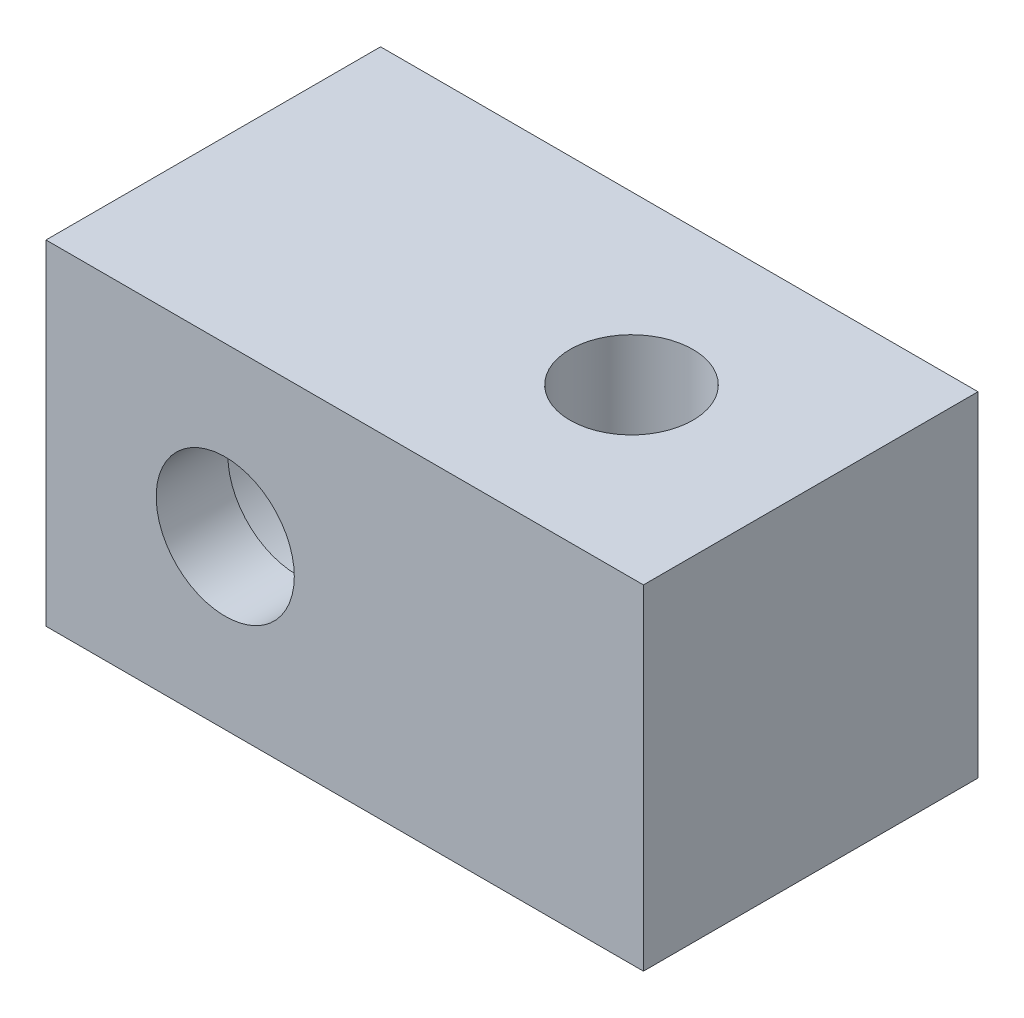
ISO-10303-21;
HEADER;
FILE_DESCRIPTION(('STEP AP214'),'2;1');
FILE_NAME('part.step','',(''),(''),'','','');
FILE_SCHEMA(('AUTOMOTIVE_DESIGN { 1 0 10303 214 1 1 1 1 }'));
ENDSEC;
DATA;
#1=APPLICATION_CONTEXT('core data for automotive mechanical design processes');
#2=APPLICATION_PROTOCOL_DEFINITION('international standard','automotive_design',2000,#1);
#3=PRODUCT_CONTEXT('',#1,'mechanical');
#4=PRODUCT('Part','Part','',(#3));
#5=PRODUCT_RELATED_PRODUCT_CATEGORY('part','',(#4));
#6=PRODUCT_DEFINITION_FORMATION('','',#4);
#7=PRODUCT_DEFINITION_CONTEXT('part definition',#1,'design');
#8=PRODUCT_DEFINITION('design','',#6,#7);
#9=PRODUCT_DEFINITION_SHAPE('','',#8);
#10=(LENGTH_UNIT() NAMED_UNIT(*) SI_UNIT(.MILLI.,.METRE.));
#11=(NAMED_UNIT(*) PLANE_ANGLE_UNIT() SI_UNIT($,.RADIAN.));
#12=(NAMED_UNIT(*) SI_UNIT($,.STERADIAN.) SOLID_ANGLE_UNIT());
#13=UNCERTAINTY_MEASURE_WITH_UNIT(LENGTH_MEASURE(1.E-05),#10,'distance_accuracy_value','');
#14=(GEOMETRIC_REPRESENTATION_CONTEXT(3) GLOBAL_UNCERTAINTY_ASSIGNED_CONTEXT((#13)) GLOBAL_UNIT_ASSIGNED_CONTEXT((#10,
#11,#12)) REPRESENTATION_CONTEXT('',''));
#15=CARTESIAN_POINT('',(0.,0.,0.));
#16=DIRECTION('',(0.,0.,1.));
#17=DIRECTION('',(1.,0.,0.));
#18=AXIS2_PLACEMENT_3D('',#15,#16,#17);
#19=CARTESIAN_POINT('',(15.875,17.78,-8.89));
#20=DIRECTION('',(-1.,0.,0.));
#21=DIRECTION('',(0.,0.,1.));
#22=AXIS2_PLACEMENT_3D('',#19,#20,#21);
#23=PLANE('',#22);
#24=DIRECTION('',(0.,0.,-1.));
#25=VECTOR('',#24,1.);
#26=CARTESIAN_POINT('',(15.875,0.,-8.89));
#27=LINE('',#26,#25);
#28=CARTESIAN_POINT('',(15.875,0.,8.89));
#29=VERTEX_POINT('',#28);
#30=CARTESIAN_POINT('',(15.875,0.,-8.89));
#31=VERTEX_POINT('',#30);
#32=EDGE_CURVE('E100',#29,#31,#27,.T.);
#33=ORIENTED_EDGE('',*,*,#32,.T.);
#34=DIRECTION('',(0.,-1.,0.));
#35=VECTOR('',#34,1.);
#36=CARTESIAN_POINT('',(15.875,17.78,-8.89));
#37=LINE('',#36,#35);
#38=CARTESIAN_POINT('',(15.875,17.78,-8.89));
#39=VERTEX_POINT('',#38);
#40=EDGE_CURVE('E11',#39,#31,#37,.T.);
#41=ORIENTED_EDGE('',*,*,#40,.F.);
#42=DIRECTION('',(0.,0.,-1.));
#43=VECTOR('',#42,1.);
#44=CARTESIAN_POINT('',(15.875,17.78,-8.89));
#45=LINE('',#44,#43);
#46=CARTESIAN_POINT('',(15.875,17.78,8.89));
#47=VERTEX_POINT('',#46);
#48=EDGE_CURVE('E88',#47,#39,#45,.T.);
#49=ORIENTED_EDGE('',*,*,#48,.F.);
#50=DIRECTION('',(0.,-1.,0.));
#51=VECTOR('',#50,1.);
#52=CARTESIAN_POINT('',(15.875,17.78,8.89));
#53=LINE('',#52,#51);
#54=EDGE_CURVE('E96',#47,#29,#53,.T.);
#55=ORIENTED_EDGE('',*,*,#54,.T.);
#56=EDGE_LOOP('',(#33,#41,#49,#55));
#57=FACE_BOUND('',#56,.T.);
#58=ADVANCED_FACE('F37',(#57),#23,.F.);
#59=CARTESIAN_POINT('',(-15.875,17.78,-8.89));
#60=DIRECTION('',(0.,0.,1.));
#61=DIRECTION('',(1.,0.,0.));
#62=AXIS2_PLACEMENT_3D('',#59,#60,#61);
#63=PLANE('',#62);
#64=CARTESIAN_POINT('',(-6.35,8.89,-8.89));
#65=DIRECTION('',(0.,0.,-1.));
#66=DIRECTION('',(-1.,0.,0.));
#67=AXIS2_PLACEMENT_3D('',#64,#65,#66);
#68=CIRCLE('',#67,6.4389);
#69=CARTESIAN_POINT('',(-12.7889,8.89,-8.89));
#70=VERTEX_POINT('',#69);
#71=EDGE_CURVE('E114',#70,#70,#68,.T.);
#72=ORIENTED_EDGE('',*,*,#71,.F.);
#73=EDGE_LOOP('',(#72));
#74=FACE_BOUND('',#73,.T.);
#75=DIRECTION('',(-1.,0.,0.));
#76=VECTOR('',#75,1.);
#77=CARTESIAN_POINT('',(-15.875,0.,-8.89));
#78=LINE('',#77,#76);
#79=CARTESIAN_POINT('',(-15.875,0.,-8.89));
#80=VERTEX_POINT('',#79);
#81=EDGE_CURVE('E92',#31,#80,#78,.T.);
#82=ORIENTED_EDGE('',*,*,#81,.T.);
#83=DIRECTION('',(0.,-1.,0.));
#84=VECTOR('',#83,1.);
#85=CARTESIAN_POINT('',(-15.875,17.78,-8.89));
#86=LINE('',#85,#84);
#87=CARTESIAN_POINT('',(-15.875,17.78,-8.89));
#88=VERTEX_POINT('',#87);
#89=EDGE_CURVE('E45',#88,#80,#86,.T.);
#90=ORIENTED_EDGE('',*,*,#89,.F.);
#91=DIRECTION('',(-1.,0.,0.));
#92=VECTOR('',#91,1.);
#93=CARTESIAN_POINT('',(-15.875,17.78,-8.89));
#94=LINE('',#93,#92);
#95=EDGE_CURVE('E83',#39,#88,#94,.T.);
#96=ORIENTED_EDGE('',*,*,#95,.F.);
#97=ORIENTED_EDGE('',*,*,#40,.T.);
#98=EDGE_LOOP('',(#82,#90,#96,#97));
#99=FACE_BOUND('',#98,.T.);
#100=ADVANCED_FACE('F91',(#74,#99),#63,.F.);
#101=CARTESIAN_POINT('',(-15.875,17.78,-8.89));
#102=DIRECTION('',(1.,0.,0.));
#103=DIRECTION('',(0.,0.,-1.));
#104=AXIS2_PLACEMENT_3D('',#101,#102,#103);
#105=PLANE('',#104);
#106=DIRECTION('',(0.,0.,1.));
#107=VECTOR('',#106,1.);
#108=CARTESIAN_POINT('',(-15.875,0.,-8.89));
#109=LINE('',#108,#107);
#110=CARTESIAN_POINT('',(-15.875,0.,8.89));
#111=VERTEX_POINT('',#110);
#112=EDGE_CURVE('E70',#80,#111,#109,.T.);
#113=ORIENTED_EDGE('',*,*,#112,.T.);
#114=DIRECTION('',(0.,-1.,0.));
#115=VECTOR('',#114,1.);
#116=CARTESIAN_POINT('',(-15.875,17.78,8.89));
#117=LINE('',#116,#115);
#118=CARTESIAN_POINT('',(-15.875,17.78,8.89));
#119=VERTEX_POINT('',#118);
#120=EDGE_CURVE('E93',#119,#111,#117,.T.);
#121=ORIENTED_EDGE('',*,*,#120,.F.);
#122=DIRECTION('',(0.,0.,1.));
#123=VECTOR('',#122,1.);
#124=CARTESIAN_POINT('',(-15.875,17.78,-8.89));
#125=LINE('',#124,#123);
#126=EDGE_CURVE('E86',#88,#119,#125,.T.);
#127=ORIENTED_EDGE('',*,*,#126,.F.);
#128=ORIENTED_EDGE('',*,*,#89,.T.);
#129=EDGE_LOOP('',(#113,#121,#127,#128));
#130=FACE_BOUND('',#129,.T.);
#131=ADVANCED_FACE('F94',(#130),#105,.F.);
#132=CARTESIAN_POINT('',(-15.875,17.78,8.89));
#133=DIRECTION('',(0.,0.,-1.));
#134=DIRECTION('',(-1.,0.,0.));
#135=AXIS2_PLACEMENT_3D('',#132,#133,#134);
#136=PLANE('',#135);
#137=CARTESIAN_POINT('',(-6.35,8.89,8.89));
#138=DIRECTION('',(0.,0.,1.));
#139=DIRECTION('',(1.,0.,0.));
#140=AXIS2_PLACEMENT_3D('',#137,#138,#139);
#141=CIRCLE('',#140,3.6703);
#142=CARTESIAN_POINT('',(-2.6797,8.89,8.89));
#143=VERTEX_POINT('',#142);
#144=EDGE_CURVE('E117',#143,#143,#141,.T.);
#145=ORIENTED_EDGE('',*,*,#144,.F.);
#146=EDGE_LOOP('',(#145));
#147=FACE_BOUND('',#146,.T.);
#148=DIRECTION('',(1.,0.,0.));
#149=VECTOR('',#148,1.);
#150=CARTESIAN_POINT('',(-15.875,0.,8.89));
#151=LINE('',#150,#149);
#152=EDGE_CURVE('E76',#111,#29,#151,.T.);
#153=ORIENTED_EDGE('',*,*,#152,.T.);
#154=ORIENTED_EDGE('',*,*,#54,.F.);
#155=DIRECTION('',(1.,0.,0.));
#156=VECTOR('',#155,1.);
#157=CARTESIAN_POINT('',(-15.875,17.78,8.89));
#158=LINE('',#157,#156);
#159=EDGE_CURVE('E53',#119,#47,#158,.T.);
#160=ORIENTED_EDGE('',*,*,#159,.F.);
#161=ORIENTED_EDGE('',*,*,#120,.T.);
#162=EDGE_LOOP('',(#153,#154,#160,#161));
#163=FACE_BOUND('',#162,.T.);
#164=ADVANCED_FACE('F108',(#147,#163),#136,.F.);
#165=CARTESIAN_POINT('',(0.,17.78,0.));
#166=DIRECTION('',(0.,1.,0.));
#167=DIRECTION('',(0.,0.,1.));
#168=AXIS2_PLACEMENT_3D('',#165,#166,#167);
#169=PLANE('',#168);
#170=CARTESIAN_POINT('',(6.35,17.78,0.));
#171=DIRECTION('',(0.,1.,0.));
#172=DIRECTION('',(0.,0.,1.));
#173=AXIS2_PLACEMENT_3D('',#170,#171,#172);
#174=CIRCLE('',#173,3.2639);
#175=CARTESIAN_POINT('',(6.35,17.78,3.2639));
#176=VERTEX_POINT('',#175);
#177=EDGE_CURVE('E128',#176,#176,#174,.T.);
#178=ORIENTED_EDGE('',*,*,#177,.F.);
#179=EDGE_LOOP('',(#178));
#180=FACE_BOUND('',#179,.T.);
#181=ORIENTED_EDGE('',*,*,#48,.T.);
#182=ORIENTED_EDGE('',*,*,#95,.T.);
#183=ORIENTED_EDGE('',*,*,#126,.T.);
#184=ORIENTED_EDGE('',*,*,#159,.T.);
#185=EDGE_LOOP('',(#181,#182,#183,#184));
#186=FACE_BOUND('',#185,.T.);
#187=ADVANCED_FACE('F84',(#180,#186),#169,.T.);
#188=CARTESIAN_POINT('',(0.,0.,0.));
#189=DIRECTION('',(0.,1.,0.));
#190=DIRECTION('',(0.,0.,1.));
#191=AXIS2_PLACEMENT_3D('',#188,#189,#190);
#192=PLANE('',#191);
#193=CARTESIAN_POINT('',(6.35,0.,0.));
#194=DIRECTION('',(0.,1.,0.));
#195=DIRECTION('',(0.,0.,1.));
#196=AXIS2_PLACEMENT_3D('',#193,#194,#195);
#197=CIRCLE('',#196,3.2639);
#198=CARTESIAN_POINT('',(6.35,0.,3.2639));
#199=VERTEX_POINT('',#198);
#200=EDGE_CURVE('E123',#199,#199,#197,.T.);
#201=ORIENTED_EDGE('',*,*,#200,.T.);
#202=EDGE_LOOP('',(#201));
#203=FACE_BOUND('',#202,.T.);
#204=ORIENTED_EDGE('',*,*,#32,.F.);
#205=ORIENTED_EDGE('',*,*,#152,.F.);
#206=ORIENTED_EDGE('',*,*,#112,.F.);
#207=ORIENTED_EDGE('',*,*,#81,.F.);
#208=EDGE_LOOP('',(#204,#205,#206,#207));
#209=FACE_BOUND('',#208,.T.);
#210=ADVANCED_FACE('F111',(#203,#209),#192,.F.);
#211=CARTESIAN_POINT('',(-6.35,8.89,5.08));
#212=DIRECTION('',(0.,0.,-1.));
#213=DIRECTION('',(-1.,0.,0.));
#214=AXIS2_PLACEMENT_3D('',#211,#212,#213);
#215=CYLINDRICAL_SURFACE('',#214,6.4389);
#216=CARTESIAN_POINT('',(-6.35,8.89,5.08));
#217=DIRECTION('',(0.,0.,-1.));
#218=DIRECTION('',(-1.,0.,0.));
#219=AXIS2_PLACEMENT_3D('',#216,#217,#218);
#220=CIRCLE('',#219,6.4389);
#221=CARTESIAN_POINT('',(-12.7889,8.89,5.08));
#222=VERTEX_POINT('',#221);
#223=EDGE_CURVE('E103',#222,#222,#220,.T.);
#224=ORIENTED_EDGE('',*,*,#223,.F.);
#225=EDGE_LOOP('',(#224));
#226=FACE_BOUND('',#225,.T.);
#227=ORIENTED_EDGE('',*,*,#71,.T.);
#228=EDGE_LOOP('',(#227));
#229=FACE_BOUND('',#228,.T.);
#230=ADVANCED_FACE('F140',(#226,#229),#215,.F.);
#231=CARTESIAN_POINT('',(-6.35,8.89,5.08));
#232=DIRECTION('',(0.,0.,-1.));
#233=DIRECTION('',(-1.,0.,0.));
#234=AXIS2_PLACEMENT_3D('',#231,#232,#233);
#235=PLANE('',#234);
#236=CARTESIAN_POINT('',(-6.35,8.89,5.08));
#237=DIRECTION('',(0.,0.,-1.));
#238=DIRECTION('',(-1.,0.,0.));
#239=AXIS2_PLACEMENT_3D('',#236,#237,#238);
#240=CIRCLE('',#239,3.6703);
#241=CARTESIAN_POINT('',(-10.0203,8.89,5.08));
#242=VERTEX_POINT('',#241);
#243=EDGE_CURVE('E120',#242,#242,#240,.F.);
#244=ORIENTED_EDGE('',*,*,#243,.T.);
#245=EDGE_LOOP('',(#244));
#246=FACE_BOUND('',#245,.T.);
#247=ORIENTED_EDGE('',*,*,#223,.T.);
#248=EDGE_LOOP('',(#247));
#249=FACE_BOUND('',#248,.T.);
#250=ADVANCED_FACE('F158',(#246,#249),#235,.T.);
#251=CARTESIAN_POINT('',(-6.35,8.89,-8.891));
#252=DIRECTION('',(0.,0.,1.));
#253=DIRECTION('',(1.,0.,0.));
#254=AXIS2_PLACEMENT_3D('',#251,#252,#253);
#255=CYLINDRICAL_SURFACE('',#254,3.6703);
#256=ORIENTED_EDGE('',*,*,#243,.F.);
#257=EDGE_LOOP('',(#256));
#258=FACE_BOUND('',#257,.T.);
#259=ORIENTED_EDGE('',*,*,#144,.T.);
#260=EDGE_LOOP('',(#259));
#261=FACE_BOUND('',#260,.T.);
#262=ADVANCED_FACE('F163',(#258,#261),#255,.F.);
#263=CARTESIAN_POINT('',(6.35,17.78,0.));
#264=DIRECTION('',(0.,1.,0.));
#265=DIRECTION('',(0.,0.,1.));
#266=AXIS2_PLACEMENT_3D('',#263,#264,#265);
#267=CYLINDRICAL_SURFACE('',#266,3.2639);
#268=ORIENTED_EDGE('',*,*,#200,.F.);
#269=EDGE_LOOP('',(#268));
#270=FACE_BOUND('',#269,.T.);
#271=ORIENTED_EDGE('',*,*,#177,.T.);
#272=EDGE_LOOP('',(#271));
#273=FACE_BOUND('',#272,.T.);
#274=ADVANCED_FACE('F132',(#270,#273),#267,.F.);
#275=CLOSED_SHELL('',(#58,#100,#131,#164,#187,#210,#230,#250,#262,#274));
#276=MANIFOLD_SOLID_BREP('B2',#275);
#277=ADVANCED_BREP_SHAPE_REPRESENTATION('',(#18,#276),#14);
#278=SHAPE_DEFINITION_REPRESENTATION(#9,#277);
ENDSEC;
END-ISO-10303-21;
